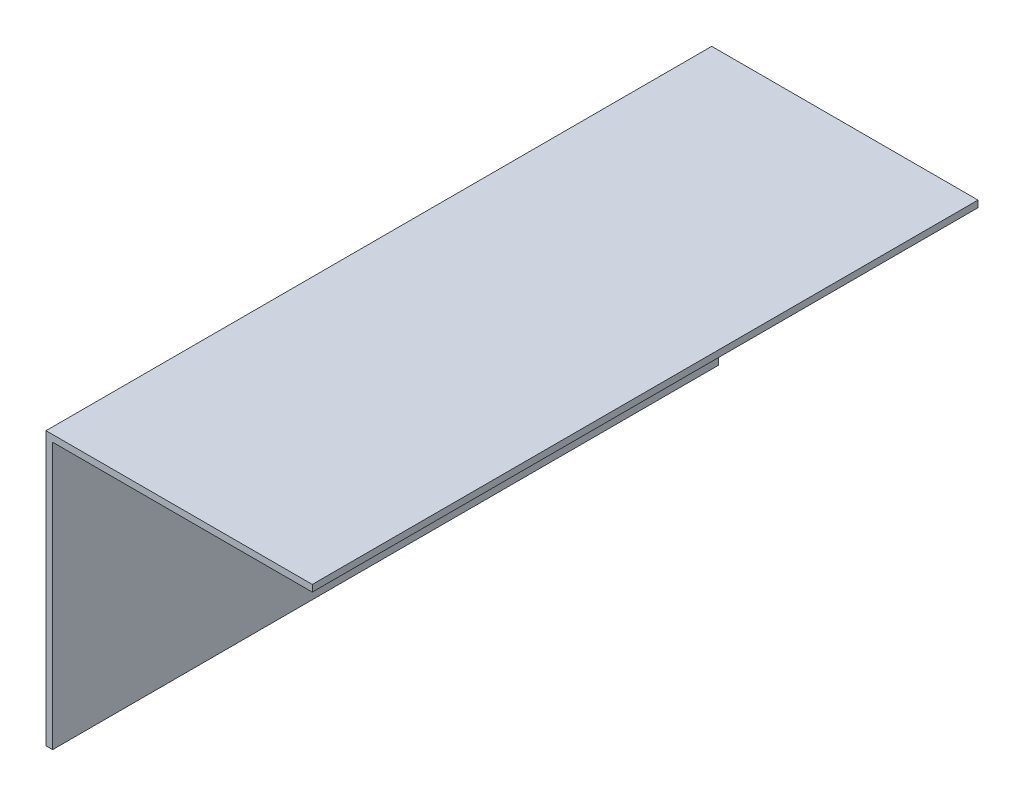
ISO-10303-21;
HEADER;
FILE_DESCRIPTION(('STEP AP214'),'2;1');
FILE_NAME('part.step','',(''),(''),'','','');
FILE_SCHEMA(('AUTOMOTIVE_DESIGN { 1 0 10303 214 1 1 1 1 }'));
ENDSEC;
DATA;
#1=APPLICATION_CONTEXT('core data for automotive mechanical design processes');
#2=APPLICATION_PROTOCOL_DEFINITION('international standard','automotive_design',2000,#1);
#3=PRODUCT_CONTEXT('',#1,'mechanical');
#4=PRODUCT('Part','Part','',(#3));
#5=PRODUCT_RELATED_PRODUCT_CATEGORY('part','',(#4));
#6=PRODUCT_DEFINITION_FORMATION('','',#4);
#7=PRODUCT_DEFINITION_CONTEXT('part definition',#1,'design');
#8=PRODUCT_DEFINITION('design','',#6,#7);
#9=PRODUCT_DEFINITION_SHAPE('','',#8);
#10=(LENGTH_UNIT() NAMED_UNIT(*) SI_UNIT(.MILLI.,.METRE.));
#11=(NAMED_UNIT(*) PLANE_ANGLE_UNIT() SI_UNIT($,.RADIAN.));
#12=(NAMED_UNIT(*) SI_UNIT($,.STERADIAN.) SOLID_ANGLE_UNIT());
#13=UNCERTAINTY_MEASURE_WITH_UNIT(LENGTH_MEASURE(1.E-05),#10,'distance_accuracy_value','');
#14=(GEOMETRIC_REPRESENTATION_CONTEXT(3) GLOBAL_UNCERTAINTY_ASSIGNED_CONTEXT((#13)) GLOBAL_UNIT_ASSIGNED_CONTEXT((#10,
#11,#12)) REPRESENTATION_CONTEXT('',''));
#15=CARTESIAN_POINT('',(0.,0.,0.));
#16=DIRECTION('',(0.,0.,1.));
#17=DIRECTION('',(1.,0.,0.));
#18=AXIS2_PLACEMENT_3D('',#15,#16,#17);
#19=CARTESIAN_POINT('',(-128.,60.,-150.));
#20=DIRECTION('',(0.,0.,1.));
#21=DIRECTION('',(1.,0.,0.));
#22=AXIS2_PLACEMENT_3D('',#19,#20,#21);
#23=PLANE('',#22);
#24=DIRECTION('',(0.,-1.,0.));
#25=VECTOR('',#24,1.);
#26=CARTESIAN_POINT('',(-125.,60.,-150.));
#27=LINE('',#26,#25);
#28=CARTESIAN_POINT('',(-125.,60.,-150.));
#29=VERTEX_POINT('',#28);
#30=CARTESIAN_POINT('',(-125.,-60.,-150.));
#31=VERTEX_POINT('',#30);
#32=EDGE_CURVE('E83',#29,#31,#27,.T.);
#33=ORIENTED_EDGE('',*,*,#32,.T.);
#34=DIRECTION('',(1.,0.,0.));
#35=VECTOR('',#34,1.);
#36=CARTESIAN_POINT('',(-128.,-60.,-150.));
#37=LINE('',#36,#35);
#38=CARTESIAN_POINT('',(-128.,-60.,-150.));
#39=VERTEX_POINT('',#38);
#40=EDGE_CURVE('E11',#39,#31,#37,.T.);
#41=ORIENTED_EDGE('',*,*,#40,.F.);
#42=DIRECTION('',(0.,-1.,0.));
#43=VECTOR('',#42,1.);
#44=CARTESIAN_POINT('',(-128.,60.,-150.));
#45=LINE('',#44,#43);
#46=CARTESIAN_POINT('',(-128.,63.,-150.));
#47=VERTEX_POINT('',#46);
#48=EDGE_CURVE('E98',#47,#39,#45,.T.);
#49=ORIENTED_EDGE('',*,*,#48,.F.);
#50=DIRECTION('',(-1.,0.,0.));
#51=VECTOR('',#50,1.);
#52=CARTESIAN_POINT('',(-128.,63.,-150.));
#53=LINE('',#52,#51);
#54=CARTESIAN_POINT('',(-7.99999999999995,63.,-150.));
#55=VERTEX_POINT('',#54);
#56=EDGE_CURVE('E111',#55,#47,#53,.T.);
#57=ORIENTED_EDGE('',*,*,#56,.F.);
#58=DIRECTION('',(0.,-1.,0.));
#59=VECTOR('',#58,1.);
#60=CARTESIAN_POINT('',(-7.99999999999995,63.,-150.));
#61=LINE('',#60,#59);
#62=CARTESIAN_POINT('',(-7.99999999999995,60.,-150.));
#63=VERTEX_POINT('',#62);
#64=EDGE_CURVE('E117',#55,#63,#61,.T.);
#65=ORIENTED_EDGE('',*,*,#64,.T.);
#66=DIRECTION('',(-1.,0.,0.));
#67=VECTOR('',#66,1.);
#68=CARTESIAN_POINT('',(-128.,60.,-150.));
#69=LINE('',#68,#67);
#70=EDGE_CURVE('E108',#63,#29,#69,.T.);
#71=ORIENTED_EDGE('',*,*,#70,.T.);
#72=EDGE_LOOP('',(#33,#41,#49,#57,#65,#71));
#73=FACE_BOUND('',#72,.T.);
#74=ADVANCED_FACE('F45',(#73),#23,.F.);
#75=CARTESIAN_POINT('',(-128.,-60.,150.));
#76=DIRECTION('',(0.,-1.,0.));
#77=DIRECTION('',(0.,0.,-1.));
#78=AXIS2_PLACEMENT_3D('',#75,#76,#77);
#79=PLANE('',#78);
#80=DIRECTION('',(0.,0.,-1.));
#81=VECTOR('',#80,1.);
#82=CARTESIAN_POINT('',(-125.,-60.,150.));
#83=LINE('',#82,#81);
#84=CARTESIAN_POINT('',(-125.,-60.,150.));
#85=VERTEX_POINT('',#84);
#86=EDGE_CURVE('E99',#85,#31,#83,.T.);
#87=ORIENTED_EDGE('',*,*,#86,.F.);
#88=DIRECTION('',(1.,0.,0.));
#89=VECTOR('',#88,1.);
#90=CARTESIAN_POINT('',(-128.,-60.,150.));
#91=LINE('',#90,#89);
#92=CARTESIAN_POINT('',(-128.,-60.,150.));
#93=VERTEX_POINT('',#92);
#94=EDGE_CURVE('E54',#93,#85,#91,.T.);
#95=ORIENTED_EDGE('',*,*,#94,.F.);
#96=DIRECTION('',(0.,0.,-1.));
#97=VECTOR('',#96,1.);
#98=CARTESIAN_POINT('',(-128.,-60.,150.));
#99=LINE('',#98,#97);
#100=EDGE_CURVE('E125',#93,#39,#99,.T.);
#101=ORIENTED_EDGE('',*,*,#100,.T.);
#102=ORIENTED_EDGE('',*,*,#40,.T.);
#103=EDGE_LOOP('',(#87,#95,#101,#102));
#104=FACE_BOUND('',#103,.T.);
#105=ADVANCED_FACE('F173',(#104),#79,.T.);
#106=CARTESIAN_POINT('',(-128.,60.,150.));
#107=DIRECTION('',(0.,0.,1.));
#108=DIRECTION('',(1.,0.,0.));
#109=AXIS2_PLACEMENT_3D('',#106,#107,#108);
#110=PLANE('',#109);
#111=DIRECTION('',(0.,-1.,0.));
#112=VECTOR('',#111,1.);
#113=CARTESIAN_POINT('',(-125.,60.,150.));
#114=LINE('',#113,#112);
#115=CARTESIAN_POINT('',(-125.,60.,150.));
#116=VERTEX_POINT('',#115);
#117=EDGE_CURVE('E81',#116,#85,#114,.T.);
#118=ORIENTED_EDGE('',*,*,#117,.F.);
#119=DIRECTION('',(1.,0.,0.));
#120=VECTOR('',#119,1.);
#121=CARTESIAN_POINT('',(-128.,60.,150.));
#122=LINE('',#121,#120);
#123=CARTESIAN_POINT('',(-7.99999999999995,60.,150.));
#124=VERTEX_POINT('',#123);
#125=EDGE_CURVE('E95',#116,#124,#122,.T.);
#126=ORIENTED_EDGE('',*,*,#125,.T.);
#127=DIRECTION('',(0.,-1.,0.));
#128=VECTOR('',#127,1.);
#129=CARTESIAN_POINT('',(-7.99999999999995,63.,150.));
#130=LINE('',#129,#128);
#131=CARTESIAN_POINT('',(-7.99999999999995,63.,150.));
#132=VERTEX_POINT('',#131);
#133=EDGE_CURVE('E89',#132,#124,#130,.T.);
#134=ORIENTED_EDGE('',*,*,#133,.F.);
#135=DIRECTION('',(1.,0.,0.));
#136=VECTOR('',#135,1.);
#137=CARTESIAN_POINT('',(-128.,63.,150.));
#138=LINE('',#137,#136);
#139=CARTESIAN_POINT('',(-128.,63.,150.));
#140=VERTEX_POINT('',#139);
#141=EDGE_CURVE('E141',#140,#132,#138,.T.);
#142=ORIENTED_EDGE('',*,*,#141,.F.);
#143=DIRECTION('',(0.,-1.,0.));
#144=VECTOR('',#143,1.);
#145=CARTESIAN_POINT('',(-128.,60.,150.));
#146=LINE('',#145,#144);
#147=EDGE_CURVE('E128',#140,#93,#146,.T.);
#148=ORIENTED_EDGE('',*,*,#147,.T.);
#149=ORIENTED_EDGE('',*,*,#94,.T.);
#150=EDGE_LOOP('',(#118,#126,#134,#142,#148,#149));
#151=FACE_BOUND('',#150,.T.);
#152=ADVANCED_FACE('F92',(#151),#110,.T.);
#153=CARTESIAN_POINT('',(-128.,0.,0.));
#154=DIRECTION('',(-1.,0.,0.));
#155=DIRECTION('',(0.,0.,1.));
#156=AXIS2_PLACEMENT_3D('',#153,#154,#155);
#157=PLANE('',#156);
#158=ORIENTED_EDGE('',*,*,#147,.F.);
#159=DIRECTION('',(0.,0.,1.));
#160=VECTOR('',#159,1.);
#161=CARTESIAN_POINT('',(-128.,63.,150.));
#162=LINE('',#161,#160);
#163=EDGE_CURVE('E116',#47,#140,#162,.T.);
#164=ORIENTED_EDGE('',*,*,#163,.F.);
#165=ORIENTED_EDGE('',*,*,#48,.T.);
#166=ORIENTED_EDGE('',*,*,#100,.F.);
#167=EDGE_LOOP('',(#158,#164,#165,#166));
#168=FACE_BOUND('',#167,.T.);
#169=ADVANCED_FACE('F159',(#168),#157,.T.);
#170=CARTESIAN_POINT('',(-125.,0.,0.));
#171=DIRECTION('',(-1.,0.,0.));
#172=DIRECTION('',(0.,0.,1.));
#173=AXIS2_PLACEMENT_3D('',#170,#171,#172);
#174=PLANE('',#173);
#175=DIRECTION('',(0.,0.,-1.));
#176=VECTOR('',#175,1.);
#177=CARTESIAN_POINT('',(-125.,60.,150.));
#178=LINE('',#177,#176);
#179=EDGE_CURVE('E78',#116,#29,#178,.T.);
#180=ORIENTED_EDGE('',*,*,#179,.F.);
#181=ORIENTED_EDGE('',*,*,#117,.T.);
#182=ORIENTED_EDGE('',*,*,#86,.T.);
#183=ORIENTED_EDGE('',*,*,#32,.F.);
#184=EDGE_LOOP('',(#180,#181,#182,#183));
#185=FACE_BOUND('',#184,.T.);
#186=ADVANCED_FACE('F79',(#185),#174,.F.);
#187=CARTESIAN_POINT('',(-7.99999999999995,63.,150.));
#188=DIRECTION('',(-1.,0.,0.));
#189=DIRECTION('',(0.,0.,1.));
#190=AXIS2_PLACEMENT_3D('',#187,#188,#189);
#191=PLANE('',#190);
#192=DIRECTION('',(0.,0.,-1.));
#193=VECTOR('',#192,1.);
#194=CARTESIAN_POINT('',(-7.99999999999995,60.,150.));
#195=LINE('',#194,#193);
#196=EDGE_CURVE('E104',#124,#63,#195,.T.);
#197=ORIENTED_EDGE('',*,*,#196,.T.);
#198=ORIENTED_EDGE('',*,*,#64,.F.);
#199=DIRECTION('',(0.,0.,-1.));
#200=VECTOR('',#199,1.);
#201=CARTESIAN_POINT('',(-7.99999999999995,63.,150.));
#202=LINE('',#201,#200);
#203=EDGE_CURVE('E138',#132,#55,#202,.T.);
#204=ORIENTED_EDGE('',*,*,#203,.F.);
#205=ORIENTED_EDGE('',*,*,#133,.T.);
#206=EDGE_LOOP('',(#197,#198,#204,#205));
#207=FACE_BOUND('',#206,.T.);
#208=ADVANCED_FACE('F171',(#207),#191,.F.);
#209=CARTESIAN_POINT('',(0.,63.,0.));
#210=DIRECTION('',(0.,-1.,0.));
#211=DIRECTION('',(0.,0.,-1.));
#212=AXIS2_PLACEMENT_3D('',#209,#210,#211);
#213=PLANE('',#212);
#214=ORIENTED_EDGE('',*,*,#163,.T.);
#215=ORIENTED_EDGE('',*,*,#141,.T.);
#216=ORIENTED_EDGE('',*,*,#203,.T.);
#217=ORIENTED_EDGE('',*,*,#56,.T.);
#218=EDGE_LOOP('',(#214,#215,#216,#217));
#219=FACE_BOUND('',#218,.T.);
#220=ADVANCED_FACE('F150',(#219),#213,.F.);
#221=CARTESIAN_POINT('',(0.,60.,0.));
#222=DIRECTION('',(0.,-1.,0.));
#223=DIRECTION('',(0.,0.,-1.));
#224=AXIS2_PLACEMENT_3D('',#221,#222,#223);
#225=PLANE('',#224);
#226=ORIENTED_EDGE('',*,*,#125,.F.);
#227=ORIENTED_EDGE('',*,*,#179,.T.);
#228=ORIENTED_EDGE('',*,*,#70,.F.);
#229=ORIENTED_EDGE('',*,*,#196,.F.);
#230=EDGE_LOOP('',(#226,#227,#228,#229));
#231=FACE_BOUND('',#230,.T.);
#232=ADVANCED_FACE('F102',(#231),#225,.T.);
#233=CLOSED_SHELL('',(#74,#105,#152,#169,#186,#208,#220,#232));
#234=MANIFOLD_SOLID_BREP('B2',#233);
#235=ADVANCED_BREP_SHAPE_REPRESENTATION('',(#18,#234),#14);
#236=SHAPE_DEFINITION_REPRESENTATION(#9,#235);
ENDSEC;
END-ISO-10303-21;
